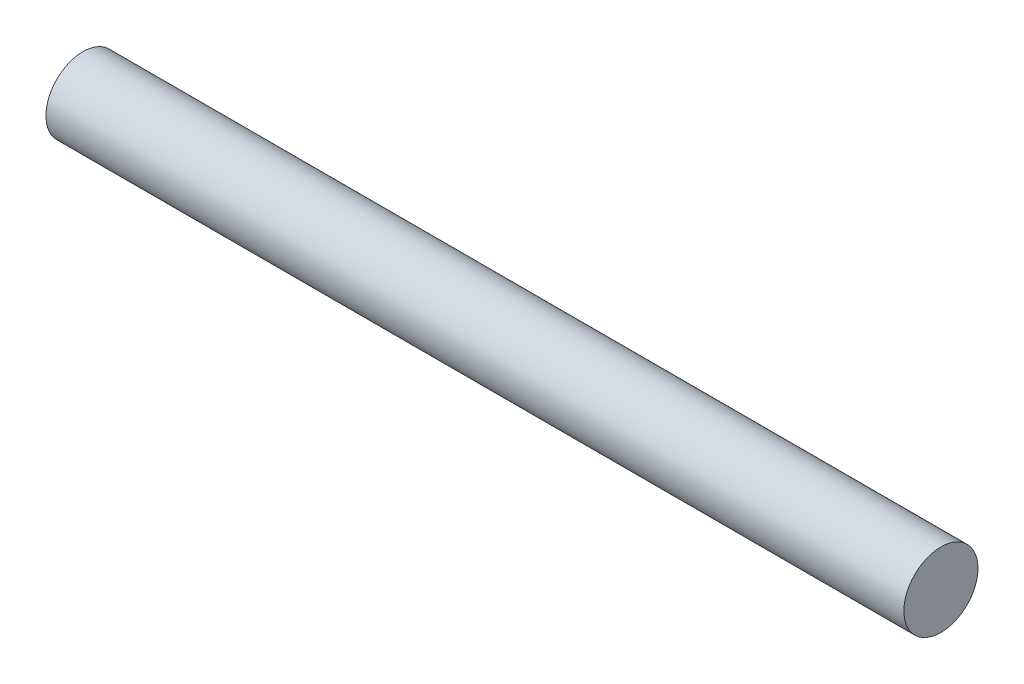
ISO-10303-21;
HEADER;
FILE_DESCRIPTION(('STEP AP214'),'2;1');
FILE_NAME('part.step','',(''),(''),'','','');
FILE_SCHEMA(('AUTOMOTIVE_DESIGN { 1 0 10303 214 1 1 1 1 }'));
ENDSEC;
DATA;
#1=APPLICATION_CONTEXT('core data for automotive mechanical design processes');
#2=APPLICATION_PROTOCOL_DEFINITION('international standard','automotive_design',2000,#1);
#3=PRODUCT_CONTEXT('',#1,'mechanical');
#4=PRODUCT('Part','Part','',(#3));
#5=PRODUCT_RELATED_PRODUCT_CATEGORY('part','',(#4));
#6=PRODUCT_DEFINITION_FORMATION('','',#4);
#7=PRODUCT_DEFINITION_CONTEXT('part definition',#1,'design');
#8=PRODUCT_DEFINITION('design','',#6,#7);
#9=PRODUCT_DEFINITION_SHAPE('','',#8);
#10=(LENGTH_UNIT() NAMED_UNIT(*) SI_UNIT(.MILLI.,.METRE.));
#11=(NAMED_UNIT(*) PLANE_ANGLE_UNIT() SI_UNIT($,.RADIAN.));
#12=(NAMED_UNIT(*) SI_UNIT($,.STERADIAN.) SOLID_ANGLE_UNIT());
#13=UNCERTAINTY_MEASURE_WITH_UNIT(LENGTH_MEASURE(1.E-05),#10,'distance_accuracy_value','');
#14=(GEOMETRIC_REPRESENTATION_CONTEXT(3) GLOBAL_UNCERTAINTY_ASSIGNED_CONTEXT((#13)) GLOBAL_UNIT_ASSIGNED_CONTEXT((#10,
#11,#12)) REPRESENTATION_CONTEXT('',''));
#15=CARTESIAN_POINT('',(0.,0.,0.));
#16=DIRECTION('',(0.,0.,1.));
#17=DIRECTION('',(1.,0.,0.));
#18=AXIS2_PLACEMENT_3D('',#15,#16,#17);
#19=CARTESIAN_POINT('',(69.420000098,0.,0.));
#20=DIRECTION('',(-1.,0.,0.));
#21=DIRECTION('',(0.,0.,1.));
#22=AXIS2_PLACEMENT_3D('',#19,#20,#21);
#23=CYLINDRICAL_SURFACE('',#22,3.);
#24=CARTESIAN_POINT('',(69.420000098,0.,0.));
#25=DIRECTION('',(1.,0.,0.));
#26=DIRECTION('',(0.,0.,-1.));
#27=AXIS2_PLACEMENT_3D('',#24,#25,#26);
#28=CIRCLE('',#27,3.);
#29=CARTESIAN_POINT('',(69.420000098,0.,-3.));
#30=VERTEX_POINT('',#29);
#31=EDGE_CURVE('E10',#30,#30,#28,.T.);
#32=ORIENTED_EDGE('',*,*,#31,.F.);
#33=EDGE_LOOP('',(#32));
#34=FACE_BOUND('',#33,.T.);
#35=CARTESIAN_POINT('',(0.,0.,0.));
#36=DIRECTION('',(1.,0.,0.));
#37=DIRECTION('',(0.,0.,-1.));
#38=AXIS2_PLACEMENT_3D('',#35,#36,#37);
#39=CIRCLE('',#38,3.);
#40=CARTESIAN_POINT('',(0.,0.,-3.));
#41=VERTEX_POINT('',#40);
#42=EDGE_CURVE('E42',#41,#41,#39,.T.);
#43=ORIENTED_EDGE('',*,*,#42,.T.);
#44=EDGE_LOOP('',(#43));
#45=FACE_BOUND('',#44,.T.);
#46=ADVANCED_FACE('F41',(#34,#45),#23,.T.);
#47=CARTESIAN_POINT('',(69.420000098,0.,0.));
#48=DIRECTION('',(1.,0.,0.));
#49=DIRECTION('',(0.,0.,-1.));
#50=AXIS2_PLACEMENT_3D('',#47,#48,#49);
#51=PLANE('',#50);
#52=ORIENTED_EDGE('',*,*,#31,.T.);
#53=EDGE_LOOP('',(#52));
#54=FACE_BOUND('',#53,.T.);
#55=ADVANCED_FACE('F57',(#54),#51,.T.);
#56=CARTESIAN_POINT('',(0.,0.,0.));
#57=DIRECTION('',(1.,0.,0.));
#58=DIRECTION('',(0.,0.,-1.));
#59=AXIS2_PLACEMENT_3D('',#56,#57,#58);
#60=PLANE('',#59);
#61=ORIENTED_EDGE('',*,*,#42,.F.);
#62=EDGE_LOOP('',(#61));
#63=FACE_BOUND('',#62,.T.);
#64=ADVANCED_FACE('F53',(#63),#60,.F.);
#65=CLOSED_SHELL('',(#46,#55,#64));
#66=MANIFOLD_SOLID_BREP('B2',#65);
#67=ADVANCED_BREP_SHAPE_REPRESENTATION('',(#18,#66),#14);
#68=SHAPE_DEFINITION_REPRESENTATION(#9,#67);
ENDSEC;
END-ISO-10303-21;
